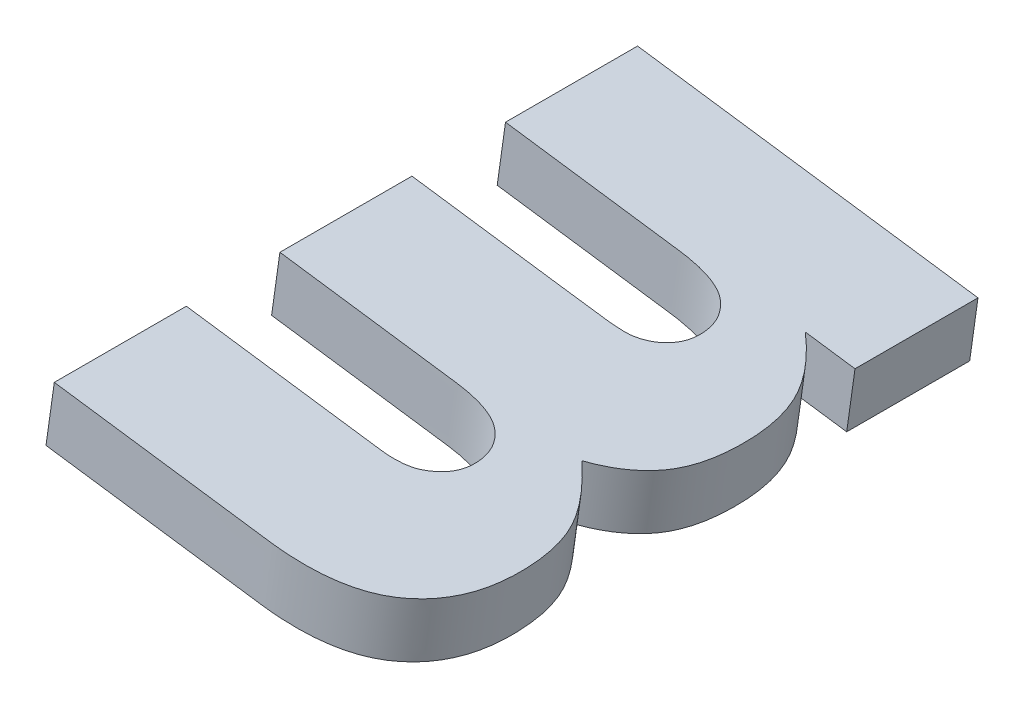
ISO-10303-21;
HEADER;
FILE_DESCRIPTION(('STEP AP214'),'2;1');
FILE_NAME('part.step','',(''),(''),'','','');
FILE_SCHEMA(('AUTOMOTIVE_DESIGN { 1 0 10303 214 1 1 1 1 }'));
ENDSEC;
DATA;
#1=APPLICATION_CONTEXT('core data for automotive mechanical design processes');
#2=APPLICATION_PROTOCOL_DEFINITION('international standard','automotive_design',2000,#1);
#3=PRODUCT_CONTEXT('',#1,'mechanical');
#4=PRODUCT('Part','Part','',(#3));
#5=PRODUCT_RELATED_PRODUCT_CATEGORY('part','',(#4));
#6=PRODUCT_DEFINITION_FORMATION('','',#4);
#7=PRODUCT_DEFINITION_CONTEXT('part definition',#1,'design');
#8=PRODUCT_DEFINITION('design','',#6,#7);
#9=PRODUCT_DEFINITION_SHAPE('','',#8);
#10=(LENGTH_UNIT() NAMED_UNIT(*) SI_UNIT(.MILLI.,.METRE.));
#11=(NAMED_UNIT(*) PLANE_ANGLE_UNIT() SI_UNIT($,.RADIAN.));
#12=(NAMED_UNIT(*) SI_UNIT($,.STERADIAN.) SOLID_ANGLE_UNIT());
#13=UNCERTAINTY_MEASURE_WITH_UNIT(LENGTH_MEASURE(1.E-05),#10,'distance_accuracy_value','');
#14=(GEOMETRIC_REPRESENTATION_CONTEXT(3) GLOBAL_UNCERTAINTY_ASSIGNED_CONTEXT((#13)) GLOBAL_UNIT_ASSIGNED_CONTEXT((#10,
#11,#12)) REPRESENTATION_CONTEXT('',''));
#15=CARTESIAN_POINT('',(0.,0.,0.));
#16=DIRECTION('',(0.,0.,1.));
#17=DIRECTION('',(1.,0.,0.));
#18=AXIS2_PLACEMENT_3D('',#15,#16,#17);
#19=CARTESIAN_POINT('',(861.920874673089,614.94386770406,2143.78292400977));
#20=DIRECTION('',(0.990268068741567,-0.139173100960088,0.));
#21=DIRECTION('',(-0.000106014336867855,-0.000754331202662197,-0.999999709872657));
#22=AXIS2_PLACEMENT_3D('',#19,#20,#21);
#23=PLANE('',#22);
#24=CARTESIAN_POINT('',(860.529144067268,605.041189889683,2143.79054145425));
#25=CARTESIAN_POINT('',(860.530243260938,605.049011059042,2154.15888769576));
#26=CARTESIAN_POINT('',(860.531342454608,605.056832228401,2164.52723393728));
#27=B_SPLINE_CURVE_WITH_KNOTS('',2,(#24,#25,#26),.UNSPECIFIED.,.F.,.F.,(3,3),(0.,1.),.UNSPECIFIED.);
#28=CARTESIAN_POINT('',(860.529144067268,605.041189889683,2143.79054145425));
#29=VERTEX_POINT('',#28);
#30=CARTESIAN_POINT('',(860.531342454608,605.056832228401,2164.52723393728));
#31=VERTEX_POINT('',#30);
#32=EDGE_CURVE('E135',#29,#31,#27,.T.);
#33=ORIENTED_EDGE('',*,*,#32,.F.);
#34=DIRECTION('',(-0.139173060582166,-0.990267781437723,0.000761744447259926));
#35=VECTOR('',#34,1.);
#36=CARTESIAN_POINT('',(861.920874673089,614.94386770406,2143.78292400977));
#37=LINE('',#36,#35);
#38=CARTESIAN_POINT('',(861.920874673089,614.94386770406,2143.78292400977));
#39=VERTEX_POINT('',#38);
#40=EDGE_CURVE('E33',#39,#29,#37,.T.);
#41=ORIENTED_EDGE('',*,*,#40,.F.);
#42=CARTESIAN_POINT('',(861.920874673089,614.94386770406,2143.78292400977));
#43=CARTESIAN_POINT('',(861.92197386676,614.951688873419,2154.15127025129));
#44=CARTESIAN_POINT('',(861.923073060429,614.959510042779,2164.51961649281));
#45=B_SPLINE_CURVE_WITH_KNOTS('',2,(#42,#43,#44),.UNSPECIFIED.,.F.,.F.,(3,3),(0.,1.),.UNSPECIFIED.);
#46=CARTESIAN_POINT('',(861.923073060429,614.959510042779,2164.51961649281));
#47=VERTEX_POINT('',#46);
#48=EDGE_CURVE('E211',#39,#47,#45,.T.);
#49=ORIENTED_EDGE('',*,*,#48,.T.);
#50=DIRECTION('',(-0.139173060582166,-0.990267781437723,0.000761744447259926));
#51=VECTOR('',#50,1.);
#52=CARTESIAN_POINT('',(861.923073060429,614.959510042779,2164.51961649281));
#53=LINE('',#52,#51);
#54=EDGE_CURVE('E11',#47,#31,#53,.T.);
#55=ORIENTED_EDGE('',*,*,#54,.T.);
#56=EDGE_LOOP('',(#33,#41,#49,#55));
#57=FACE_BOUND('',#56,.T.);
#58=ADVANCED_FACE('F17',(#57),#23,.T.);
#59=CARTESIAN_POINT('',(861.923073060429,614.959510042779,2164.51961649281));
#60=DIRECTION('',(0.000106014336847426,0.000754331202665069,0.999999709872657));
#61=DIRECTION('',(0.990268068741567,-0.139173100960088,0.));
#62=AXIS2_PLACEMENT_3D('',#59,#60,#61);
#63=PLANE('',#62);
#64=CARTESIAN_POINT('',(860.531342454608,605.056832228401,2164.52723393728));
#65=CARTESIAN_POINT('',(856.343305601813,605.645422423458,2164.52723393728));
#66=CARTESIAN_POINT('',(852.155268749017,606.234012618514,2164.52723393728));
#67=B_SPLINE_CURVE_WITH_KNOTS('',2,(#64,#65,#66),.UNSPECIFIED.,.F.,.F.,(3,3),(1.,2.),.UNSPECIFIED.);
#68=CARTESIAN_POINT('',(852.155268749017,606.234012618514,2164.52723393728));
#69=VERTEX_POINT('',#68);
#70=EDGE_CURVE('E143',#31,#69,#67,.T.);
#71=ORIENTED_EDGE('',*,*,#70,.F.);
#72=ORIENTED_EDGE('',*,*,#54,.F.);
#73=CARTESIAN_POINT('',(861.923073060429,614.959510042779,2164.51961649281));
#74=CARTESIAN_POINT('',(857.735036207634,615.548100237835,2164.51961649281));
#75=CARTESIAN_POINT('',(853.546999354839,616.136690432891,2164.51961649281));
#76=B_SPLINE_CURVE_WITH_KNOTS('',2,(#73,#74,#75),.UNSPECIFIED.,.F.,.F.,(3,3),(1.,2.),.UNSPECIFIED.);
#77=CARTESIAN_POINT('',(853.546999354839,616.136690432891,2164.51961649281));
#78=VERTEX_POINT('',#77);
#79=EDGE_CURVE('E227',#47,#78,#76,.T.);
#80=ORIENTED_EDGE('',*,*,#79,.T.);
#81=DIRECTION('',(-0.139173060582166,-0.990267781437723,0.000761744447259926));
#82=VECTOR('',#81,1.);
#83=CARTESIAN_POINT('',(853.546999354839,616.136690432891,2164.51961649281));
#84=LINE('',#83,#82);
#85=EDGE_CURVE('E25',#78,#69,#84,.T.);
#86=ORIENTED_EDGE('',*,*,#85,.T.);
#87=EDGE_LOOP('',(#71,#72,#80,#86));
#88=FACE_BOUND('',#87,.T.);
#89=ADVANCED_FACE('F226',(#88),#63,.T.);
#90=CARTESIAN_POINT('',(853.546999354839,616.136690432891,2164.51961649281));
#91=CARTESIAN_POINT('',(858.789275430984,615.403383947592,2169.00119773009));
#92=CARTESIAN_POINT('',(861.005365768724,615.095442769652,2173.56420800242));
#93=CARTESIAN_POINT('',(863.221456106464,614.787501591711,2178.12721827474));
#94=CARTESIAN_POINT('',(863.222139757922,614.792366024595,2184.57588625374));
#95=CARTESIAN_POINT('',(863.222875566842,614.79760157711,2191.51653908318));
#96=CARTESIAN_POINT('',(860.791540972729,615.142414267816,2195.5607057134));
#97=CARTESIAN_POINT('',(858.360206378616,615.487226958521,2199.60487234362));
#98=CARTESIAN_POINT('',(853.550991163431,616.165093626879,2202.17308442253));
#99=B_SPLINE_CURVE_WITH_KNOTS('',2,(#90,#91,#92,#93,#94,#95,#96,#97,#98),.UNSPECIFIED.,.F.,.F.,
(3,2,2,2,3),(2.,3.,4.,5.,6.),.UNSPECIFIED.);
#100=DIRECTION('',(-0.139173060582166,-0.990267781437723,0.000761744447259926));
#101=VECTOR('',#100,1.);
#102=SURFACE_OF_LINEAR_EXTRUSION('',#99,#101);
#103=CARTESIAN_POINT('',(852.155268749017,606.234012618514,2164.52723393728));
#104=CARTESIAN_POINT('',(857.397544825162,605.500706133215,2169.00881517456));
#105=CARTESIAN_POINT('',(859.613635162902,605.192764955274,2173.57182544689));
#106=CARTESIAN_POINT('',(861.829725500642,604.884823777334,2178.13483571922));
#107=CARTESIAN_POINT('',(861.8304091521,604.889688210218,2184.58350369822));
#108=CARTESIAN_POINT('',(861.83114496102,604.894923762733,2191.52415652765));
#109=CARTESIAN_POINT('',(859.399810366907,605.239736453438,2195.56832315788));
#110=CARTESIAN_POINT('',(856.968475772794,605.584549144144,2199.6124897881));
#111=CARTESIAN_POINT('',(852.159260557609,606.262415812502,2202.180701867));
#112=B_SPLINE_CURVE_WITH_KNOTS('',2,(#103,#104,#105,#106,#107,#108,#109,#110,#111),
.UNSPECIFIED.,.F.,.F.,(3,2,2,2,3),(2.,3.,4.,5.,6.),.UNSPECIFIED.);
#113=CARTESIAN_POINT('',(852.159260557609,606.262415812502,2202.180701867));
#114=VERTEX_POINT('',#113);
#115=EDGE_CURVE('E151',#69,#114,#112,.T.);
#116=ORIENTED_EDGE('',*,*,#115,.F.);
#117=ORIENTED_EDGE('',*,*,#85,.F.);
#118=CARTESIAN_POINT('',(853.550991163431,616.165093626879,2202.17308442253));
#119=VERTEX_POINT('',#118);
#120=EDGE_CURVE('E236',#78,#119,#99,.T.);
#121=ORIENTED_EDGE('',*,*,#120,.T.);
#122=DIRECTION('',(-0.139173060582166,-0.990267781437723,0.000761744447259926));
#123=VECTOR('',#122,1.);
#124=CARTESIAN_POINT('',(853.550991163431,616.165093626879,2202.17308442253));
#125=LINE('',#124,#123);
#126=EDGE_CURVE('E224',#119,#114,#125,.T.);
#127=ORIENTED_EDGE('',*,*,#126,.T.);
#128=EDGE_LOOP('',(#116,#117,#121,#127));
#129=FACE_BOUND('',#128,.T.);
#130=ADVANCED_FACE('F231',(#129),#102,.T.);
#131=CARTESIAN_POINT('',(853.550991163431,616.165093626879,2202.17308442253));
#132=CARTESIAN_POINT('',(859.171621082867,615.379190161898,2207.40500650624));
#133=CARTESIAN_POINT('',(861.198546928165,615.097635912186,2211.71008711261));
#134=CARTESIAN_POINT('',(863.225472773465,614.816081662474,2216.01516771897));
#135=CARTESIAN_POINT('',(863.226142956184,614.820850260305,2222.33678935011));
#136=CARTESIAN_POINT('',(863.227130874574,614.827879664905,2231.65551106668));
#137=CARTESIAN_POINT('',(857.742708190756,615.602689234252,2236.88700682037));
#138=CARTESIAN_POINT('',(852.258285506939,616.377498803599,2242.11850257406));
#139=CARTESIAN_POINT('',(840.58582150431,618.017956637563,2242.11850257406));
#140=CARTESIAN_POINT('',(822.563753240991,620.550793154353,2242.11850257406));
#141=CARTESIAN_POINT('',(804.541684977672,623.083629671144,2242.11850257406));
#142=B_SPLINE_CURVE_WITH_KNOTS('',2,(#131,#132,#133,#134,#135,#136,#137,#138,#139,#140,#141),
.UNSPECIFIED.,.F.,.F.,(3,2,2,2,2,3),(6.,7.,8.,9.,10.,11.),.UNSPECIFIED.);
#143=DIRECTION('',(-0.139173060582166,-0.990267781437723,0.000761744447259926));
#144=VECTOR('',#143,1.);
#145=SURFACE_OF_LINEAR_EXTRUSION('',#142,#144);
#146=CARTESIAN_POINT('',(852.159260557609,606.262415812502,2202.180701867));
#147=CARTESIAN_POINT('',(857.779890477045,605.47651234752,2207.41262395071));
#148=CARTESIAN_POINT('',(859.806816322344,605.194958097809,2211.71770455708));
#149=CARTESIAN_POINT('',(861.833742167643,604.913403848097,2216.02278516344));
#150=CARTESIAN_POINT('',(861.834412350362,604.918172445928,2222.34440679458));
#151=CARTESIAN_POINT('',(861.835400268752,604.925201850527,2231.66312851115));
#152=CARTESIAN_POINT('',(856.350977584935,605.700011419875,2236.89462426484));
#153=CARTESIAN_POINT('',(850.866554901117,606.474820989222,2242.12612001853));
#154=CARTESIAN_POINT('',(839.194090898488,608.115278823186,2242.12612001853));
#155=CARTESIAN_POINT('',(821.172022635169,610.648115339976,2242.12612001853));
#156=CARTESIAN_POINT('',(803.149954371851,613.180951856767,2242.12612001853));
#157=B_SPLINE_CURVE_WITH_KNOTS('',2,(#146,#147,#148,#149,#150,#151,#152,#153,#154,#155,#156),
.UNSPECIFIED.,.F.,.F.,(3,2,2,2,2,3),(6.,7.,8.,9.,10.,11.),.UNSPECIFIED.);
#158=CARTESIAN_POINT('',(803.149954371851,613.180951856767,2242.12612001853));
#159=VERTEX_POINT('',#158);
#160=EDGE_CURVE('E159',#114,#159,#157,.T.);
#161=ORIENTED_EDGE('',*,*,#160,.F.);
#162=ORIENTED_EDGE('',*,*,#126,.F.);
#163=CARTESIAN_POINT('',(804.541684977672,623.083629671144,2242.11850257406));
#164=VERTEX_POINT('',#163);
#165=EDGE_CURVE('E253',#119,#164,#142,.T.);
#166=ORIENTED_EDGE('',*,*,#165,.T.);
#167=DIRECTION('',(-0.139173060582166,-0.990267781437723,0.000761744447259926));
#168=VECTOR('',#167,1.);
#169=CARTESIAN_POINT('',(804.541684977672,623.083629671144,2242.11850257406));
#170=LINE('',#169,#168);
#171=EDGE_CURVE('E222',#164,#159,#170,.T.);
#172=ORIENTED_EDGE('',*,*,#171,.T.);
#173=EDGE_LOOP('',(#161,#162,#166,#172));
#174=FACE_BOUND('',#173,.T.);
#175=ADVANCED_FACE('F264',(#174),#145,.T.);
#176=CARTESIAN_POINT('',(804.541684977672,623.083629671144,2242.11850257406));
#177=DIRECTION('',(-0.990268068741567,0.139173100960088,0.));
#178=DIRECTION('',(0.000106014336863525,0.000754331202662807,0.999999709872657));
#179=AXIS2_PLACEMENT_3D('',#176,#177,#178);
#180=PLANE('',#179);
#181=CARTESIAN_POINT('',(803.149954371851,613.180951856767,2242.12612001853));
#182=CARTESIAN_POINT('',(803.148774184963,613.172554390718,2230.99379036975));
#183=CARTESIAN_POINT('',(803.147593998075,613.164156924669,2219.86146072096));
#184=B_SPLINE_CURVE_WITH_KNOTS('',2,(#181,#182,#183),.UNSPECIFIED.,.F.,.F.,(3,3),(11.,12.),.UNSPECIFIED.);
#185=CARTESIAN_POINT('',(803.147593998075,613.164156924669,2219.86146072096));
#186=VERTEX_POINT('',#185);
#187=EDGE_CURVE('E167',#159,#186,#184,.T.);
#188=ORIENTED_EDGE('',*,*,#187,.F.);
#189=ORIENTED_EDGE('',*,*,#171,.F.);
#190=CARTESIAN_POINT('',(804.541684977672,623.083629671144,2242.11850257406));
#191=CARTESIAN_POINT('',(804.540504790784,623.075232205095,2230.98617292527));
#192=CARTESIAN_POINT('',(804.539324603897,623.066834739047,2219.85384327648));
#193=B_SPLINE_CURVE_WITH_KNOTS('',2,(#190,#191,#192),.UNSPECIFIED.,.F.,.F.,(3,3),(11.,12.),.UNSPECIFIED.);
#194=CARTESIAN_POINT('',(804.539324603897,623.066834739047,2219.85384327648));
#195=VERTEX_POINT('',#194);
#196=EDGE_CURVE('E378',#164,#195,#193,.T.);
#197=ORIENTED_EDGE('',*,*,#196,.T.);
#198=DIRECTION('',(-0.139173060582166,-0.990267781437723,0.000761744447259926));
#199=VECTOR('',#198,1.);
#200=CARTESIAN_POINT('',(804.539324603897,623.066834739047,2219.85384327648));
#201=LINE('',#200,#199);
#202=EDGE_CURVE('E220',#195,#186,#201,.T.);
#203=ORIENTED_EDGE('',*,*,#202,.T.);
#204=EDGE_LOOP('',(#188,#189,#197,#203));
#205=FACE_BOUND('',#204,.T.);
#206=ADVANCED_FACE('F299',(#205),#180,.T.);
#207=CARTESIAN_POINT('',(804.539324603897,623.066834739047,2219.85384327648));
#208=CARTESIAN_POINT('',(820.886178126097,620.769434300278,2219.85384327648));
#209=CARTESIAN_POINT('',(837.233031648297,618.47203386151,2219.85384327648));
#210=CARTESIAN_POINT('',(841.123852982507,617.925214583523,2219.85384327648));
#211=CARTESIAN_POINT('',(843.045414286545,617.65401618272,2218.37110071541));
#212=CARTESIAN_POINT('',(845.986981825324,617.238859814463,2216.1012863843));
#213=CARTESIAN_POINT('',(845.986630191822,617.236357812094,2212.78443877908));
#214=CARTESIAN_POINT('',(845.986215101581,617.23340429156,2208.86902381683));
#215=CARTESIAN_POINT('',(843.17592377995,617.626524217783,2206.47603337876));
#216=CARTESIAN_POINT('',(840.36563245832,618.019644144007,2204.0830429407));
#217=CARTESIAN_POINT('',(834.151126160624,618.893036046348,2204.0830429407));
#218=CARTESIAN_POINT('',(819.344389416548,620.97398718758,2204.0830429407));
#219=CARTESIAN_POINT('',(804.537652672472,623.054938328811,2204.0830429407));
#220=B_SPLINE_CURVE_WITH_KNOTS('',2,(#207,#208,#209,#210,#211,#212,#213,#214,#215,#216,#217,
#218,#219),.UNSPECIFIED.,.F.,.F.,(3,2,2,2,2,2,3),(12.,13.,14.,15.,16.,17.,18.),.UNSPECIFIED.);
#221=DIRECTION('',(-0.139173060582166,-0.990267781437723,0.000761744447259926));
#222=VECTOR('',#221,1.);
#223=SURFACE_OF_LINEAR_EXTRUSION('',#220,#222);
#224=CARTESIAN_POINT('',(803.147593998075,613.164156924669,2219.86146072096));
#225=CARTESIAN_POINT('',(819.494447520275,610.866756485901,2219.86146072096));
#226=CARTESIAN_POINT('',(835.841301042476,608.569356047133,2219.86146072096));
#227=CARTESIAN_POINT('',(839.732122376685,608.022536769145,2219.86146072096));
#228=CARTESIAN_POINT('',(841.653683680723,607.751338368343,2218.37871815989));
#229=CARTESIAN_POINT('',(844.595251219502,607.336182000086,2216.10890382878));
#230=CARTESIAN_POINT('',(844.594899586,607.333679997717,2212.79205622355));
#231=CARTESIAN_POINT('',(844.59448449576,607.330726477182,2208.8766412613));
#232=CARTESIAN_POINT('',(841.784193174129,607.723846403406,2206.48365082323));
#233=CARTESIAN_POINT('',(838.973901852498,608.116966329629,2204.09066038517));
#234=CARTESIAN_POINT('',(832.759395554802,608.990358231971,2204.09066038517));
#235=CARTESIAN_POINT('',(817.952658810726,611.071309373202,2204.09066038517));
#236=CARTESIAN_POINT('',(803.145922066651,613.152260514434,2204.09066038517));
#237=B_SPLINE_CURVE_WITH_KNOTS('',2,(#224,#225,#226,#227,#228,#229,#230,#231,#232,#233,#234,
#235,#236),.UNSPECIFIED.,.F.,.F.,(3,2,2,2,2,2,3),(12.,13.,14.,15.,16.,17.,18.),.UNSPECIFIED.);
#238=CARTESIAN_POINT('',(803.145922066651,613.152260514434,2204.09066038517));
#239=VERTEX_POINT('',#238);
#240=EDGE_CURVE('E175',#186,#239,#237,.T.);
#241=ORIENTED_EDGE('',*,*,#240,.F.);
#242=ORIENTED_EDGE('',*,*,#202,.F.);
#243=CARTESIAN_POINT('',(804.537652672472,623.054938328811,2204.0830429407));
#244=VERTEX_POINT('',#243);
#245=EDGE_CURVE('E373',#195,#244,#220,.T.);
#246=ORIENTED_EDGE('',*,*,#245,.T.);
#247=DIRECTION('',(-0.139173060582166,-0.990267781437723,0.000761744447259926));
#248=VECTOR('',#247,1.);
#249=CARTESIAN_POINT('',(804.537652672472,623.054938328811,2204.0830429407));
#250=LINE('',#249,#248);
#251=EDGE_CURVE('E218',#244,#239,#250,.T.);
#252=ORIENTED_EDGE('',*,*,#251,.T.);
#253=EDGE_LOOP('',(#241,#242,#246,#252));
#254=FACE_BOUND('',#253,.T.);
#255=ADVANCED_FACE('F308',(#254),#223,.T.);
#256=CARTESIAN_POINT('',(804.537652672472,623.054938328811,2204.0830429407));
#257=DIRECTION('',(-0.990268068741567,0.139173100960088,0.));
#258=DIRECTION('',(0.000106014336869076,0.000754331202662023,0.999999709872657));
#259=AXIS2_PLACEMENT_3D('',#256,#257,#258);
#260=PLANE('',#259);
#261=CARTESIAN_POINT('',(803.145922066651,613.152260514434,2204.09066038517));
#262=CARTESIAN_POINT('',(803.144741879763,613.143863048385,2192.95833073639));
#263=CARTESIAN_POINT('',(803.143561692875,613.135465582336,2181.8260010876));
#264=B_SPLINE_CURVE_WITH_KNOTS('',2,(#261,#262,#263),.UNSPECIFIED.,.F.,.F.,(3,3),(18.,19.),.UNSPECIFIED.);
#265=CARTESIAN_POINT('',(803.143561692875,613.135465582336,2181.8260010876));
#266=VERTEX_POINT('',#265);
#267=EDGE_CURVE('E183',#239,#266,#264,.T.);
#268=ORIENTED_EDGE('',*,*,#267,.F.);
#269=ORIENTED_EDGE('',*,*,#251,.F.);
#270=CARTESIAN_POINT('',(804.537652672472,623.054938328811,2204.0830429407));
#271=CARTESIAN_POINT('',(804.536472485584,623.046540862762,2192.95071329192));
#272=CARTESIAN_POINT('',(804.535292298696,623.038143396713,2181.81838364312));
#273=B_SPLINE_CURVE_WITH_KNOTS('',2,(#270,#271,#272),.UNSPECIFIED.,.F.,.F.,(3,3),(18.,19.),.UNSPECIFIED.);
#274=CARTESIAN_POINT('',(804.535292298696,623.038143396713,2181.81838364312));
#275=VERTEX_POINT('',#274);
#276=EDGE_CURVE('E116',#244,#275,#273,.T.);
#277=ORIENTED_EDGE('',*,*,#276,.T.);
#278=DIRECTION('',(-0.139173060582166,-0.990267781437723,0.000761744447259926));
#279=VECTOR('',#278,1.);
#280=CARTESIAN_POINT('',(804.535292298696,623.038143396713,2181.81838364312));
#281=LINE('',#280,#279);
#282=EDGE_CURVE('E108',#275,#266,#281,.T.);
#283=ORIENTED_EDGE('',*,*,#282,.T.);
#284=EDGE_LOOP('',(#268,#269,#277,#283));
#285=FACE_BOUND('',#284,.T.);
#286=ADVANCED_FACE('F317',(#285),#260,.T.);
#287=CARTESIAN_POINT('',(804.535292298696,623.038143396713,2181.81838364312));
#288=CARTESIAN_POINT('',(820.341753968924,620.816690079888,2181.81838364312));
#289=CARTESIAN_POINT('',(836.14821563915,618.595236763063,2181.81838364312));
#290=CARTESIAN_POINT('',(839.930958602965,618.063606909463,2181.81838364312));
#291=CARTESIAN_POINT('',(841.280690711945,617.873574427463,2181.37637742973));
#292=CARTESIAN_POINT('',(843.443383698996,617.56908295586,2180.66814523196));
#293=CARTESIAN_POINT('',(844.767157976217,617.381690755206,2178.91592882355));
#294=CARTESIAN_POINT('',(846.090932253437,617.194298554552,2177.16371241513));
#295=CARTESIAN_POINT('',(846.090682675006,617.192522711739,2174.80951800947));
#296=CARTESIAN_POINT('',(846.09027626261,617.189630937279,2170.97595841228));
#297=CARTESIAN_POINT('',(843.225938207865,617.590291869476,2168.51177085981));
#298=CARTESIAN_POINT('',(840.36160015312,617.990952801673,2166.04758330735));
#299=CARTESIAN_POINT('',(833.822858744239,618.909912977181,2166.04758330735));
#300=CARTESIAN_POINT('',(819.178239555756,620.968079981829,2166.04758330735));
#301=CARTESIAN_POINT('',(804.533620367272,623.026246986478,2166.04758330735));
#302=B_SPLINE_CURVE_WITH_KNOTS('',2,(#287,#288,#289,#290,#291,#292,#293,#294,#295,#296,#297,
#298,#299,#300,#301),.UNSPECIFIED.,.F.,.F.,(3,2,2,2,2,2,2,3),(19.,20.,21.,22.,23.,24.,25.,26.),.UNSPECIFIED.);
#303=DIRECTION('',(-0.139173060582166,-0.990267781437723,0.000761744447259926));
#304=VECTOR('',#303,1.);
#305=SURFACE_OF_LINEAR_EXTRUSION('',#302,#304);
#306=CARTESIAN_POINT('',(803.143561692875,613.135465582336,2181.8260010876));
#307=CARTESIAN_POINT('',(818.950023363102,610.914012265511,2181.8260010876));
#308=CARTESIAN_POINT('',(834.756485033329,608.692558948685,2181.8260010876));
#309=CARTESIAN_POINT('',(838.539227997144,608.160929095086,2181.8260010876));
#310=CARTESIAN_POINT('',(839.888960106123,607.970896613086,2181.38399487421));
#311=CARTESIAN_POINT('',(842.051653093174,607.666405141482,2180.67576267643));
#312=CARTESIAN_POINT('',(843.375427370395,607.479012940828,2178.92354626801));
#313=CARTESIAN_POINT('',(844.699201647616,607.291620740175,2177.17132985961));
#314=CARTESIAN_POINT('',(844.698952069184,607.289844897362,2174.81713545394));
#315=CARTESIAN_POINT('',(844.698545656788,607.286953122902,2170.98357585675));
#316=CARTESIAN_POINT('',(841.834207602043,607.687614055099,2168.51938830429));
#317=CARTESIAN_POINT('',(838.969869547298,608.088274987296,2166.05520075182));
#318=CARTESIAN_POINT('',(832.431128138418,609.007235162803,2166.05520075182));
#319=CARTESIAN_POINT('',(817.786508949934,611.065402167452,2166.05520075182));
#320=CARTESIAN_POINT('',(803.14188976145,613.1235691721,2166.05520075182));
#321=B_SPLINE_CURVE_WITH_KNOTS('',2,(#306,#307,#308,#309,#310,#311,#312,#313,#314,#315,#316,
#317,#318,#319,#320),.UNSPECIFIED.,.F.,.F.,(3,2,2,2,2,2,2,3),(19.,20.,21.,22.,23.,24.,25.,26.),.UNSPECIFIED.);
#322=CARTESIAN_POINT('',(803.14188976145,613.1235691721,2166.05520075182));
#323=VERTEX_POINT('',#322);
#324=EDGE_CURVE('E191',#266,#323,#321,.T.);
#325=ORIENTED_EDGE('',*,*,#324,.F.);
#326=ORIENTED_EDGE('',*,*,#282,.F.);
#327=CARTESIAN_POINT('',(804.533620367272,623.026246986478,2166.04758330735));
#328=VERTEX_POINT('',#327);
#329=EDGE_CURVE('E111',#275,#328,#302,.T.);
#330=ORIENTED_EDGE('',*,*,#329,.T.);
#331=DIRECTION('',(-0.139173060582166,-0.990267781437723,0.000761744447259926));
#332=VECTOR('',#331,1.);
#333=CARTESIAN_POINT('',(804.533620367272,623.026246986478,2166.04758330735));
#334=LINE('',#333,#332);
#335=EDGE_CURVE('E97',#328,#323,#334,.T.);
#336=ORIENTED_EDGE('',*,*,#335,.T.);
#337=EDGE_LOOP('',(#325,#326,#330,#336));
#338=FACE_BOUND('',#337,.T.);
#339=ADVANCED_FACE('F112',(#338),#305,.T.);
#340=CARTESIAN_POINT('',(804.533620367272,623.026246986478,2166.04758330735));
#341=DIRECTION('',(-0.990268068741567,0.139173100960088,0.));
#342=DIRECTION('',(0.000106014336875737,0.000754331202661086,0.999999709872657));
#343=AXIS2_PLACEMENT_3D('',#340,#341,#342);
#344=PLANE('',#343);
#345=CARTESIAN_POINT('',(803.14188976145,613.1235691721,2166.05520075182));
#346=CARTESIAN_POINT('',(803.140709574562,613.115171706052,2154.92287110303));
#347=CARTESIAN_POINT('',(803.139529387674,613.106774240003,2143.79054145425));
#348=B_SPLINE_CURVE_WITH_KNOTS('',2,(#345,#346,#347),.UNSPECIFIED.,.F.,.F.,(3,3),(26.,27.),.UNSPECIFIED.);
#349=CARTESIAN_POINT('',(803.139529387674,613.106774240003,2143.79054145425));
#350=VERTEX_POINT('',#349);
#351=EDGE_CURVE('E104',#323,#350,#348,.T.);
#352=ORIENTED_EDGE('',*,*,#351,.F.);
#353=ORIENTED_EDGE('',*,*,#335,.F.);
#354=CARTESIAN_POINT('',(804.533620367272,623.026246986478,2166.04758330735));
#355=CARTESIAN_POINT('',(804.532440180384,623.017849520429,2154.91525365856));
#356=CARTESIAN_POINT('',(804.531259993496,623.00945205438,2143.78292400977));
#357=B_SPLINE_CURVE_WITH_KNOTS('',2,(#354,#355,#356),.UNSPECIFIED.,.F.,.F.,(3,3),(26.,27.),.UNSPECIFIED.);
#358=CARTESIAN_POINT('',(804.531259993496,623.00945205438,2143.78292400977));
#359=VERTEX_POINT('',#358);
#360=EDGE_CURVE('E101',#328,#359,#357,.T.);
#361=ORIENTED_EDGE('',*,*,#360,.T.);
#362=DIRECTION('',(-0.139173060582166,-0.990267781437723,0.000761744447259926));
#363=VECTOR('',#362,1.);
#364=CARTESIAN_POINT('',(804.531259993496,623.00945205438,2143.78292400977));
#365=LINE('',#364,#363);
#366=EDGE_CURVE('E67',#359,#350,#365,.T.);
#367=ORIENTED_EDGE('',*,*,#366,.T.);
#368=EDGE_LOOP('',(#352,#353,#361,#367));
#369=FACE_BOUND('',#368,.T.);
#370=ADVANCED_FACE('F99',(#369),#344,.T.);
#371=CARTESIAN_POINT('',(804.531259993496,623.00945205438,2143.78292400977));
#372=DIRECTION('',(-0.000106014336866911,-0.000754331202662335,-0.999999709872657));
#373=DIRECTION('',(-0.990268068741567,0.139173100960088,0.));
#374=AXIS2_PLACEMENT_3D('',#371,#372,#373);
#375=PLANE('',#374);
#376=CARTESIAN_POINT('',(803.139529387674,613.106774240003,2143.79054145425));
#377=CARTESIAN_POINT('',(831.834336727471,609.073982064843,2143.79054145425));
#378=CARTESIAN_POINT('',(860.529144067268,605.041189889683,2143.79054145425));
#379=B_SPLINE_CURVE_WITH_KNOTS('',2,(#376,#377,#378),.UNSPECIFIED.,.F.,.F.,(3,3),(27.,28.),.UNSPECIFIED.);
#380=EDGE_CURVE('E204',#350,#29,#379,.T.);
#381=ORIENTED_EDGE('',*,*,#380,.F.);
#382=ORIENTED_EDGE('',*,*,#366,.F.);
#383=CARTESIAN_POINT('',(804.531259993496,623.00945205438,2143.78292400977));
#384=CARTESIAN_POINT('',(833.226067333293,618.97665987922,2143.78292400977));
#385=CARTESIAN_POINT('',(861.920874673089,614.94386770406,2143.78292400977));
#386=B_SPLINE_CURVE_WITH_KNOTS('',2,(#383,#384,#385),.UNSPECIFIED.,.F.,.F.,(3,3),(27.,28.),.UNSPECIFIED.);
#387=EDGE_CURVE('E120',#359,#39,#386,.T.);
#388=ORIENTED_EDGE('',*,*,#387,.T.);
#389=ORIENTED_EDGE('',*,*,#40,.T.);
#390=EDGE_LOOP('',(#381,#382,#388,#389));
#391=FACE_BOUND('',#390,.T.);
#392=ADVANCED_FACE('F344',(#391),#375,.T.);
#393=CARTESIAN_POINT('',(863.222139757922,614.792366024595,2184.57588625374));
#394=DIRECTION('',(0.139173060582166,0.990267781437723,-0.000761744447259926));
#395=DIRECTION('',(-0.947941965636704,0.133001987377289,-0.289338039563609));
#396=AXIS2_PLACEMENT_3D('',#393,#394,#395);
#397=PLANE('',#396);
#398=ORIENTED_EDGE('',*,*,#48,.F.);
#399=ORIENTED_EDGE('',*,*,#387,.F.);
#400=ORIENTED_EDGE('',*,*,#360,.F.);
#401=ORIENTED_EDGE('',*,*,#329,.F.);
#402=ORIENTED_EDGE('',*,*,#276,.F.);
#403=ORIENTED_EDGE('',*,*,#245,.F.);
#404=ORIENTED_EDGE('',*,*,#196,.F.);
#405=ORIENTED_EDGE('',*,*,#165,.F.);
#406=ORIENTED_EDGE('',*,*,#120,.F.);
#407=ORIENTED_EDGE('',*,*,#79,.F.);
#408=EDGE_LOOP('',(#398,#399,#400,#401,#402,#403,#404,#405,#406,#407));
#409=FACE_BOUND('',#408,.T.);
#410=ADVANCED_FACE('F119',(#409),#397,.T.);
#411=CARTESIAN_POINT('',(861.8304091521,604.889688210218,2184.58350369822));
#412=DIRECTION('',(0.139173060582166,0.990267781437723,-0.000761744447259926));
#413=DIRECTION('',(-0.947941965636704,0.133001987377289,-0.289338039563609));
#414=AXIS2_PLACEMENT_3D('',#411,#412,#413);
#415=PLANE('',#414);
#416=ORIENTED_EDGE('',*,*,#32,.T.);
#417=ORIENTED_EDGE('',*,*,#70,.T.);
#418=ORIENTED_EDGE('',*,*,#115,.T.);
#419=ORIENTED_EDGE('',*,*,#160,.T.);
#420=ORIENTED_EDGE('',*,*,#187,.T.);
#421=ORIENTED_EDGE('',*,*,#240,.T.);
#422=ORIENTED_EDGE('',*,*,#267,.T.);
#423=ORIENTED_EDGE('',*,*,#324,.T.);
#424=ORIENTED_EDGE('',*,*,#351,.T.);
#425=ORIENTED_EDGE('',*,*,#380,.T.);
#426=EDGE_LOOP('',(#416,#417,#418,#419,#420,#421,#422,#423,#424,#425));
#427=FACE_BOUND('',#426,.T.);
#428=ADVANCED_FACE('F234',(#427),#415,.F.);
#429=CLOSED_SHELL('',(#58,#89,#130,#175,#206,#255,#286,#339,#370,#392,#410,#428));
#430=MANIFOLD_SOLID_BREP('B1',#429);
#431=ADVANCED_BREP_SHAPE_REPRESENTATION('',(#18,#430),#14);
#432=SHAPE_DEFINITION_REPRESENTATION(#9,#431);
ENDSEC;
END-ISO-10303-21;
